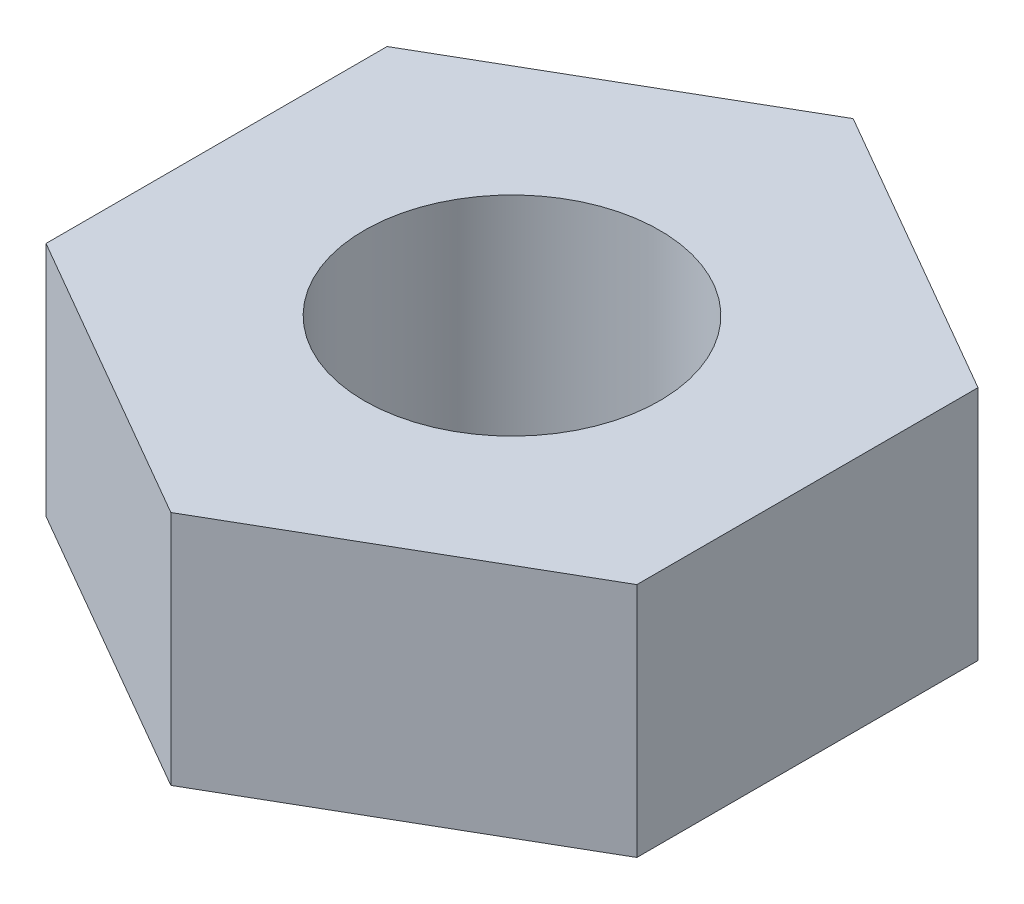
ISO-10303-21;
HEADER;
FILE_DESCRIPTION(('STEP AP214'),'2;1');
FILE_NAME('part.step','',(''),(''),'','','');
FILE_SCHEMA(('AUTOMOTIVE_DESIGN { 1 0 10303 214 1 1 1 1 }'));
ENDSEC;
DATA;
#1=APPLICATION_CONTEXT('core data for automotive mechanical design processes');
#2=APPLICATION_PROTOCOL_DEFINITION('international standard','automotive_design',2000,#1);
#3=PRODUCT_CONTEXT('',#1,'mechanical');
#4=PRODUCT('Part','Part','',(#3));
#5=PRODUCT_RELATED_PRODUCT_CATEGORY('part','',(#4));
#6=PRODUCT_DEFINITION_FORMATION('','',#4);
#7=PRODUCT_DEFINITION_CONTEXT('part definition',#1,'design');
#8=PRODUCT_DEFINITION('design','',#6,#7);
#9=PRODUCT_DEFINITION_SHAPE('','',#8);
#10=(LENGTH_UNIT() NAMED_UNIT(*) SI_UNIT(.MILLI.,.METRE.));
#11=(NAMED_UNIT(*) PLANE_ANGLE_UNIT() SI_UNIT($,.RADIAN.));
#12=(NAMED_UNIT(*) SI_UNIT($,.STERADIAN.) SOLID_ANGLE_UNIT());
#13=UNCERTAINTY_MEASURE_WITH_UNIT(LENGTH_MEASURE(1.E-05),#10,'distance_accuracy_value','');
#14=(GEOMETRIC_REPRESENTATION_CONTEXT(3) GLOBAL_UNCERTAINTY_ASSIGNED_CONTEXT((#13)) GLOBAL_UNIT_ASSIGNED_CONTEXT((#10,
#11,#12)) REPRESENTATION_CONTEXT('',''));
#15=CARTESIAN_POINT('',(0.,0.,0.));
#16=DIRECTION('',(0.,0.,1.));
#17=DIRECTION('',(1.,0.,0.));
#18=AXIS2_PLACEMENT_3D('',#15,#16,#17);
#19=CARTESIAN_POINT('',(0.,1.6,0.));
#20=DIRECTION('',(0.,1.,0.));
#21=DIRECTION('',(0.,0.,1.));
#22=AXIS2_PLACEMENT_3D('',#19,#20,#21);
#23=PLANE('',#22);
#24=DIRECTION('',(0.866025403784442,0.,0.499999999999995));
#25=VECTOR('',#24,1.);
#26=CARTESIAN_POINT('',(-1.99999999999999,1.6,1.15470053837928));
#27=LINE('',#26,#25);
#28=CARTESIAN_POINT('',(-1.99999999999999,1.6,1.15470053837928));
#29=VERTEX_POINT('',#28);
#30=CARTESIAN_POINT('',(0.,1.6,2.3094010767585));
#31=VERTEX_POINT('',#30);
#32=EDGE_CURVE('E133',#29,#31,#27,.T.);
#33=ORIENTED_EDGE('',*,*,#32,.T.);
#34=DIRECTION('',(0.866025403784438,0.,-0.500000000000001));
#35=VECTOR('',#34,1.);
#36=CARTESIAN_POINT('',(0.,1.6,2.3094010767585));
#37=LINE('',#36,#35);
#38=CARTESIAN_POINT('',(2.,1.6,1.15470053837925));
#39=VERTEX_POINT('',#38);
#40=EDGE_CURVE('E91',#31,#39,#37,.T.);
#41=ORIENTED_EDGE('',*,*,#40,.T.);
#42=DIRECTION('',(0.,0.,-1.));
#43=VECTOR('',#42,1.);
#44=CARTESIAN_POINT('',(2.,1.6,1.15470053837925));
#45=LINE('',#44,#43);
#46=CARTESIAN_POINT('',(2.,1.6,-1.15470053837926));
#47=VERTEX_POINT('',#46);
#48=EDGE_CURVE('E104',#39,#47,#45,.T.);
#49=ORIENTED_EDGE('',*,*,#48,.T.);
#50=DIRECTION('',(-0.866025403784441,0.,-0.499999999999995));
#51=VECTOR('',#50,1.);
#52=CARTESIAN_POINT('',(2.,1.6,-1.15470053837926));
#53=LINE('',#52,#51);
#54=CARTESIAN_POINT('',(0.,1.6,-2.3094010767585));
#55=VERTEX_POINT('',#54);
#56=EDGE_CURVE('E98',#47,#55,#53,.T.);
#57=ORIENTED_EDGE('',*,*,#56,.T.);
#58=DIRECTION('',(-0.866025403784435,0.,0.500000000000007));
#59=VECTOR('',#58,1.);
#60=CARTESIAN_POINT('',(0.,1.6,-2.3094010767585));
#61=LINE('',#60,#59);
#62=CARTESIAN_POINT('',(-2.00000000000001,1.6,-1.15470053837923));
#63=VERTEX_POINT('',#62);
#64=EDGE_CURVE('E102',#55,#63,#61,.T.);
#65=ORIENTED_EDGE('',*,*,#64,.T.);
#66=DIRECTION('',(0.,0.,1.));
#67=VECTOR('',#66,1.);
#68=CARTESIAN_POINT('',(-2.00000000000001,1.6,-1.15470053837923));
#69=LINE('',#68,#67);
#70=EDGE_CURVE('E54',#63,#29,#69,.T.);
#71=ORIENTED_EDGE('',*,*,#70,.T.);
#72=EDGE_LOOP('',(#33,#41,#49,#57,#65,#71));
#73=FACE_BOUND('',#72,.T.);
#74=CARTESIAN_POINT('',(0.,1.6,0.));
#75=DIRECTION('',(0.,1.,0.));
#76=DIRECTION('',(0.,0.,1.));
#77=AXIS2_PLACEMENT_3D('',#74,#75,#76);
#78=CIRCLE('',#77,1.);
#79=CARTESIAN_POINT('',(0.,1.6,1.));
#80=VERTEX_POINT('',#79);
#81=EDGE_CURVE('E126',#80,#80,#78,.T.);
#82=ORIENTED_EDGE('',*,*,#81,.F.);
#83=EDGE_LOOP('',(#82));
#84=FACE_BOUND('',#83,.T.);
#85=ADVANCED_FACE('F37',(#73,#84),#23,.T.);
#86=CARTESIAN_POINT('',(0.,0.,0.));
#87=DIRECTION('',(0.,1.,0.));
#88=DIRECTION('',(0.,0.,1.));
#89=AXIS2_PLACEMENT_3D('',#86,#87,#88);
#90=PLANE('',#89);
#91=DIRECTION('',(0.866025403784442,0.,0.499999999999995));
#92=VECTOR('',#91,1.);
#93=CARTESIAN_POINT('',(-1.99999999999999,0.,1.15470053837928));
#94=LINE('',#93,#92);
#95=CARTESIAN_POINT('',(-1.99999999999999,0.,1.15470053837928));
#96=VERTEX_POINT('',#95);
#97=CARTESIAN_POINT('',(0.,0.,2.3094010767585));
#98=VERTEX_POINT('',#97);
#99=EDGE_CURVE('E122',#96,#98,#94,.T.);
#100=ORIENTED_EDGE('',*,*,#99,.F.);
#101=DIRECTION('',(0.,0.,1.));
#102=VECTOR('',#101,1.);
#103=CARTESIAN_POINT('',(-2.00000000000001,0.,-1.15470053837923));
#104=LINE('',#103,#102);
#105=CARTESIAN_POINT('',(-2.00000000000001,0.,-1.15470053837923));
#106=VERTEX_POINT('',#105);
#107=EDGE_CURVE('E83',#106,#96,#104,.T.);
#108=ORIENTED_EDGE('',*,*,#107,.F.);
#109=DIRECTION('',(-0.866025403784435,0.,0.500000000000007));
#110=VECTOR('',#109,1.);
#111=CARTESIAN_POINT('',(0.,0.,-2.3094010767585));
#112=LINE('',#111,#110);
#113=CARTESIAN_POINT('',(0.,0.,-2.3094010767585));
#114=VERTEX_POINT('',#113);
#115=EDGE_CURVE('E77',#114,#106,#112,.T.);
#116=ORIENTED_EDGE('',*,*,#115,.F.);
#117=DIRECTION('',(-0.866025403784441,0.,-0.499999999999995));
#118=VECTOR('',#117,1.);
#119=CARTESIAN_POINT('',(2.,0.,-1.15470053837926));
#120=LINE('',#119,#118);
#121=CARTESIAN_POINT('',(2.,0.,-1.15470053837926));
#122=VERTEX_POINT('',#121);
#123=EDGE_CURVE('E112',#122,#114,#120,.T.);
#124=ORIENTED_EDGE('',*,*,#123,.F.);
#125=DIRECTION('',(0.,0.,-1.));
#126=VECTOR('',#125,1.);
#127=CARTESIAN_POINT('',(2.,0.,1.15470053837925));
#128=LINE('',#127,#126);
#129=CARTESIAN_POINT('',(2.,0.,1.15470053837925));
#130=VERTEX_POINT('',#129);
#131=EDGE_CURVE('E128',#130,#122,#128,.T.);
#132=ORIENTED_EDGE('',*,*,#131,.F.);
#133=DIRECTION('',(0.866025403784438,0.,-0.500000000000001));
#134=VECTOR('',#133,1.);
#135=CARTESIAN_POINT('',(0.,0.,2.3094010767585));
#136=LINE('',#135,#134);
#137=EDGE_CURVE('E125',#98,#130,#136,.T.);
#138=ORIENTED_EDGE('',*,*,#137,.F.);
#139=EDGE_LOOP('',(#100,#108,#116,#124,#132,#138));
#140=FACE_BOUND('',#139,.T.);
#141=CARTESIAN_POINT('',(0.,0.,0.));
#142=DIRECTION('',(0.,1.,0.));
#143=DIRECTION('',(0.,0.,1.));
#144=AXIS2_PLACEMENT_3D('',#141,#142,#143);
#145=CIRCLE('',#144,1.);
#146=CARTESIAN_POINT('',(0.,0.,1.));
#147=VERTEX_POINT('',#146);
#148=EDGE_CURVE('E226',#147,#147,#145,.T.);
#149=ORIENTED_EDGE('',*,*,#148,.T.);
#150=EDGE_LOOP('',(#149));
#151=FACE_BOUND('',#150,.T.);
#152=ADVANCED_FACE('F142',(#140,#151),#90,.F.);
#153=CARTESIAN_POINT('',(-1.99999999999999,1.6,1.15470053837928));
#154=DIRECTION('',(0.499999999999995,0.,-0.866025403784442));
#155=DIRECTION('',(-0.866025403784442,0.,-0.499999999999995));
#156=AXIS2_PLACEMENT_3D('',#153,#154,#155);
#157=PLANE('',#156);
#158=ORIENTED_EDGE('',*,*,#99,.T.);
#159=DIRECTION('',(0.,-1.,0.));
#160=VECTOR('',#159,1.);
#161=CARTESIAN_POINT('',(0.,1.6,2.3094010767585));
#162=LINE('',#161,#160);
#163=EDGE_CURVE('E11',#31,#98,#162,.T.);
#164=ORIENTED_EDGE('',*,*,#163,.F.);
#165=ORIENTED_EDGE('',*,*,#32,.F.);
#166=DIRECTION('',(0.,-1.,0.));
#167=VECTOR('',#166,1.);
#168=CARTESIAN_POINT('',(-1.99999999999999,1.6,1.15470053837928));
#169=LINE('',#168,#167);
#170=EDGE_CURVE('E118',#29,#96,#169,.T.);
#171=ORIENTED_EDGE('',*,*,#170,.T.);
#172=EDGE_LOOP('',(#158,#164,#165,#171));
#173=FACE_BOUND('',#172,.T.);
#174=ADVANCED_FACE('F39',(#173),#157,.F.);
#175=CARTESIAN_POINT('',(0.,1.6,2.3094010767585));
#176=DIRECTION('',(-0.500000000000001,0.,-0.866025403784438));
#177=DIRECTION('',(-0.866025403784438,0.,0.500000000000001));
#178=AXIS2_PLACEMENT_3D('',#175,#176,#177);
#179=PLANE('',#178);
#180=ORIENTED_EDGE('',*,*,#137,.T.);
#181=DIRECTION('',(0.,-1.,0.));
#182=VECTOR('',#181,1.);
#183=CARTESIAN_POINT('',(2.,1.6,1.15470053837925));
#184=LINE('',#183,#182);
#185=EDGE_CURVE('E46',#39,#130,#184,.T.);
#186=ORIENTED_EDGE('',*,*,#185,.F.);
#187=ORIENTED_EDGE('',*,*,#40,.F.);
#188=ORIENTED_EDGE('',*,*,#163,.T.);
#189=EDGE_LOOP('',(#180,#186,#187,#188));
#190=FACE_BOUND('',#189,.T.);
#191=ADVANCED_FACE('F167',(#190),#179,.F.);
#192=CARTESIAN_POINT('',(2.,1.6,1.15470053837925));
#193=DIRECTION('',(-1.,0.,0.));
#194=DIRECTION('',(0.,0.,1.));
#195=AXIS2_PLACEMENT_3D('',#192,#193,#194);
#196=PLANE('',#195);
#197=ORIENTED_EDGE('',*,*,#131,.T.);
#198=DIRECTION('',(0.,-1.,0.));
#199=VECTOR('',#198,1.);
#200=CARTESIAN_POINT('',(2.,1.6,-1.15470053837926));
#201=LINE('',#200,#199);
#202=EDGE_CURVE('E113',#47,#122,#201,.T.);
#203=ORIENTED_EDGE('',*,*,#202,.F.);
#204=ORIENTED_EDGE('',*,*,#48,.F.);
#205=ORIENTED_EDGE('',*,*,#185,.T.);
#206=EDGE_LOOP('',(#197,#203,#204,#205));
#207=FACE_BOUND('',#206,.T.);
#208=ADVANCED_FACE('F139',(#207),#196,.F.);
#209=CARTESIAN_POINT('',(2.,1.6,-1.15470053837926));
#210=DIRECTION('',(-0.499999999999995,0.,0.866025403784441));
#211=DIRECTION('',(0.866025403784442,0.,0.499999999999995));
#212=AXIS2_PLACEMENT_3D('',#209,#210,#211);
#213=PLANE('',#212);
#214=ORIENTED_EDGE('',*,*,#123,.T.);
#215=DIRECTION('',(0.,-1.,0.));
#216=VECTOR('',#215,1.);
#217=CARTESIAN_POINT('',(0.,1.6,-2.3094010767585));
#218=LINE('',#217,#216);
#219=EDGE_CURVE('E109',#55,#114,#218,.T.);
#220=ORIENTED_EDGE('',*,*,#219,.F.);
#221=ORIENTED_EDGE('',*,*,#56,.F.);
#222=ORIENTED_EDGE('',*,*,#202,.T.);
#223=EDGE_LOOP('',(#214,#220,#221,#222));
#224=FACE_BOUND('',#223,.T.);
#225=ADVANCED_FACE('F110',(#224),#213,.F.);
#226=CARTESIAN_POINT('',(0.,1.6,-2.3094010767585));
#227=DIRECTION('',(0.500000000000007,0.,0.866025403784435));
#228=DIRECTION('',(0.866025403784435,0.,-0.500000000000007));
#229=AXIS2_PLACEMENT_3D('',#226,#227,#228);
#230=PLANE('',#229);
#231=ORIENTED_EDGE('',*,*,#115,.T.);
#232=DIRECTION('',(0.,-1.,0.));
#233=VECTOR('',#232,1.);
#234=CARTESIAN_POINT('',(-2.00000000000001,1.6,-1.15470053837923));
#235=LINE('',#234,#233);
#236=EDGE_CURVE('E114',#63,#106,#235,.T.);
#237=ORIENTED_EDGE('',*,*,#236,.F.);
#238=ORIENTED_EDGE('',*,*,#64,.F.);
#239=ORIENTED_EDGE('',*,*,#219,.T.);
#240=EDGE_LOOP('',(#231,#237,#238,#239));
#241=FACE_BOUND('',#240,.T.);
#242=ADVANCED_FACE('F116',(#241),#230,.F.);
#243=CARTESIAN_POINT('',(-2.00000000000001,1.6,-1.15470053837923));
#244=DIRECTION('',(1.,0.,0.));
#245=DIRECTION('',(0.,0.,-1.));
#246=AXIS2_PLACEMENT_3D('',#243,#244,#245);
#247=PLANE('',#246);
#248=ORIENTED_EDGE('',*,*,#107,.T.);
#249=ORIENTED_EDGE('',*,*,#170,.F.);
#250=ORIENTED_EDGE('',*,*,#70,.F.);
#251=ORIENTED_EDGE('',*,*,#236,.T.);
#252=EDGE_LOOP('',(#248,#249,#250,#251));
#253=FACE_BOUND('',#252,.T.);
#254=ADVANCED_FACE('F147',(#253),#247,.F.);
#255=CARTESIAN_POINT('',(0.,1.6,0.));
#256=DIRECTION('',(0.,-1.,0.));
#257=DIRECTION('',(0.,0.,-1.));
#258=AXIS2_PLACEMENT_3D('',#255,#256,#257);
#259=CYLINDRICAL_SURFACE('',#258,1.);
#260=ORIENTED_EDGE('',*,*,#81,.T.);
#261=EDGE_LOOP('',(#260));
#262=FACE_BOUND('',#261,.T.);
#263=ORIENTED_EDGE('',*,*,#148,.F.);
#264=EDGE_LOOP('',(#263));
#265=FACE_BOUND('',#264,.T.);
#266=ADVANCED_FACE('F149',(#262,#265),#259,.F.);
#267=CLOSED_SHELL('',(#85,#152,#174,#191,#208,#225,#242,#254,#266));
#268=MANIFOLD_SOLID_BREP('B2',#267);
#269=ADVANCED_BREP_SHAPE_REPRESENTATION('',(#18,#268),#14);
#270=SHAPE_DEFINITION_REPRESENTATION(#9,#269);
ENDSEC;
END-ISO-10303-21;
